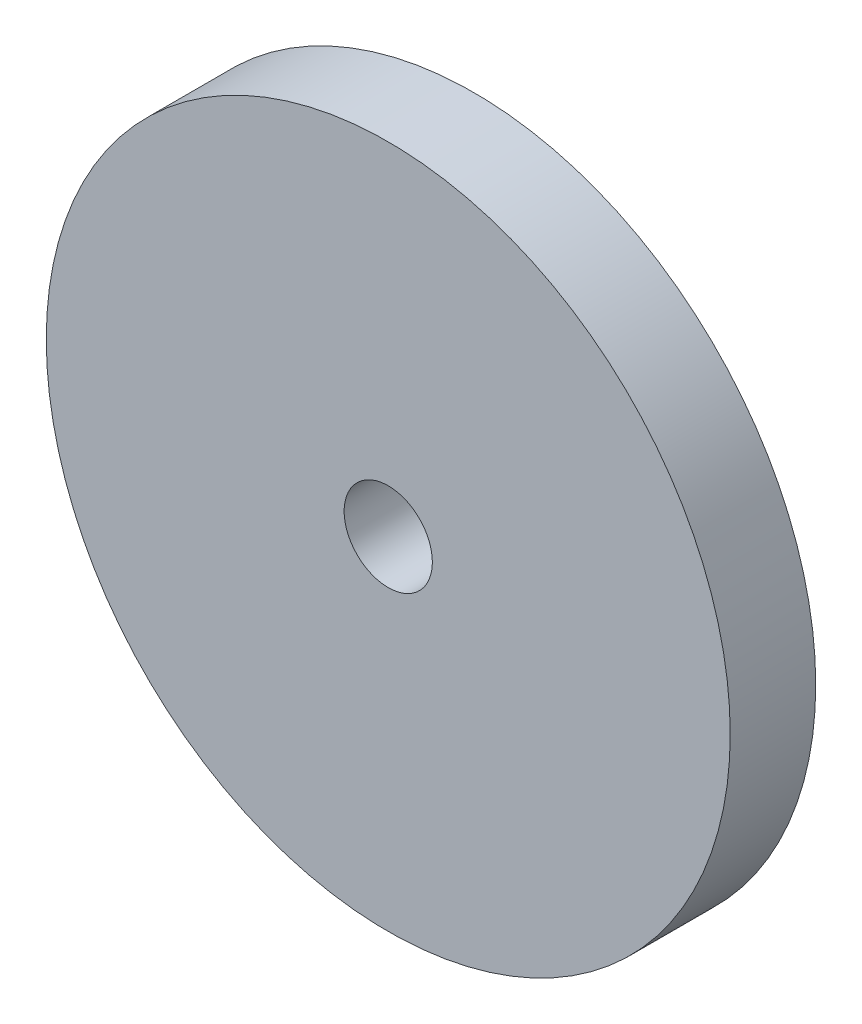
ISO-10303-21;
HEADER;
FILE_DESCRIPTION(('STEP AP214'),'2;1');
FILE_NAME('part.step','',(''),(''),'','','');
FILE_SCHEMA(('AUTOMOTIVE_DESIGN { 1 0 10303 214 1 1 1 1 }'));
ENDSEC;
DATA;
#1=APPLICATION_CONTEXT('core data for automotive mechanical design processes');
#2=APPLICATION_PROTOCOL_DEFINITION('international standard','automotive_design',2000,#1);
#3=PRODUCT_CONTEXT('',#1,'mechanical');
#4=PRODUCT('Part','Part','',(#3));
#5=PRODUCT_RELATED_PRODUCT_CATEGORY('part','',(#4));
#6=PRODUCT_DEFINITION_FORMATION('','',#4);
#7=PRODUCT_DEFINITION_CONTEXT('part definition',#1,'design');
#8=PRODUCT_DEFINITION('design','',#6,#7);
#9=PRODUCT_DEFINITION_SHAPE('','',#8);
#10=(LENGTH_UNIT() NAMED_UNIT(*) SI_UNIT(.MILLI.,.METRE.));
#11=(NAMED_UNIT(*) PLANE_ANGLE_UNIT() SI_UNIT($,.RADIAN.));
#12=(NAMED_UNIT(*) SI_UNIT($,.STERADIAN.) SOLID_ANGLE_UNIT());
#13=UNCERTAINTY_MEASURE_WITH_UNIT(LENGTH_MEASURE(1.E-05),#10,'distance_accuracy_value','');
#14=(GEOMETRIC_REPRESENTATION_CONTEXT(3) GLOBAL_UNCERTAINTY_ASSIGNED_CONTEXT((#13)) GLOBAL_UNIT_ASSIGNED_CONTEXT((#10,
#11,#12)) REPRESENTATION_CONTEXT('',''));
#15=CARTESIAN_POINT('',(0.,0.,0.));
#16=DIRECTION('',(0.,0.,1.));
#17=DIRECTION('',(1.,0.,0.));
#18=AXIS2_PLACEMENT_3D('',#15,#16,#17);
#19=CARTESIAN_POINT('',(0.,0.,6.35));
#20=DIRECTION('',(0.,0.,1.));
#21=DIRECTION('',(1.,0.,0.));
#22=AXIS2_PLACEMENT_3D('',#19,#20,#21);
#23=PLANE('',#22);
#24=CARTESIAN_POINT('',(0.,0.,6.35));
#25=DIRECTION('',(0.,0.,1.));
#26=DIRECTION('',(1.,0.,0.));
#27=AXIS2_PLACEMENT_3D('',#24,#25,#26);
#28=CIRCLE('',#27,25.4);
#29=CARTESIAN_POINT('',(25.4,0.,6.35));
#30=VERTEX_POINT('',#29);
#31=EDGE_CURVE('E10',#30,#30,#28,.T.);
#32=ORIENTED_EDGE('',*,*,#31,.T.);
#33=EDGE_LOOP('',(#32));
#34=FACE_BOUND('',#33,.T.);
#35=CARTESIAN_POINT('',(0.,0.,6.35));
#36=DIRECTION('',(0.,0.,1.));
#37=DIRECTION('',(1.,0.,0.));
#38=AXIS2_PLACEMENT_3D('',#35,#36,#37);
#39=CIRCLE('',#38,3.2766);
#40=CARTESIAN_POINT('',(3.2766,0.,6.35));
#41=VERTEX_POINT('',#40);
#42=EDGE_CURVE('E48',#41,#41,#39,.T.);
#43=ORIENTED_EDGE('',*,*,#42,.F.);
#44=EDGE_LOOP('',(#43));
#45=FACE_BOUND('',#44,.T.);
#46=ADVANCED_FACE('F37',(#34,#45),#23,.T.);
#47=CARTESIAN_POINT('',(0.,0.,0.));
#48=DIRECTION('',(0.,0.,1.));
#49=DIRECTION('',(1.,0.,0.));
#50=AXIS2_PLACEMENT_3D('',#47,#48,#49);
#51=PLANE('',#50);
#52=CARTESIAN_POINT('',(0.,0.,0.));
#53=DIRECTION('',(0.,0.,1.));
#54=DIRECTION('',(1.,0.,0.));
#55=AXIS2_PLACEMENT_3D('',#52,#53,#54);
#56=CIRCLE('',#55,25.4);
#57=CARTESIAN_POINT('',(25.4,0.,0.));
#58=VERTEX_POINT('',#57);
#59=EDGE_CURVE('E41',#58,#58,#56,.T.);
#60=ORIENTED_EDGE('',*,*,#59,.F.);
#61=EDGE_LOOP('',(#60));
#62=FACE_BOUND('',#61,.T.);
#63=CARTESIAN_POINT('',(0.,0.,0.));
#64=DIRECTION('',(0.,0.,1.));
#65=DIRECTION('',(1.,0.,0.));
#66=AXIS2_PLACEMENT_3D('',#63,#64,#65);
#67=CIRCLE('',#66,3.2766);
#68=CARTESIAN_POINT('',(3.2766,0.,0.));
#69=VERTEX_POINT('',#68);
#70=EDGE_CURVE('E50',#69,#69,#67,.T.);
#71=ORIENTED_EDGE('',*,*,#70,.T.);
#72=EDGE_LOOP('',(#71));
#73=FACE_BOUND('',#72,.T.);
#74=ADVANCED_FACE('F60',(#62,#73),#51,.F.);
#75=CARTESIAN_POINT('',(0.,0.,6.35));
#76=DIRECTION('',(0.,0.,-1.));
#77=DIRECTION('',(-1.,0.,0.));
#78=AXIS2_PLACEMENT_3D('',#75,#76,#77);
#79=CYLINDRICAL_SURFACE('',#78,25.4);
#80=ORIENTED_EDGE('',*,*,#31,.F.);
#81=EDGE_LOOP('',(#80));
#82=FACE_BOUND('',#81,.T.);
#83=ORIENTED_EDGE('',*,*,#59,.T.);
#84=EDGE_LOOP('',(#83));
#85=FACE_BOUND('',#84,.T.);
#86=ADVANCED_FACE('F39',(#82,#85),#79,.T.);
#87=CARTESIAN_POINT('',(0.,0.,6.35));
#88=DIRECTION('',(0.,0.,-1.));
#89=DIRECTION('',(-1.,0.,0.));
#90=AXIS2_PLACEMENT_3D('',#87,#88,#89);
#91=CYLINDRICAL_SURFACE('',#90,3.2766);
#92=ORIENTED_EDGE('',*,*,#42,.T.);
#93=EDGE_LOOP('',(#92));
#94=FACE_BOUND('',#93,.T.);
#95=ORIENTED_EDGE('',*,*,#70,.F.);
#96=EDGE_LOOP('',(#95));
#97=FACE_BOUND('',#96,.T.);
#98=ADVANCED_FACE('F56',(#94,#97),#91,.F.);
#99=CLOSED_SHELL('',(#46,#74,#86,#98));
#100=MANIFOLD_SOLID_BREP('B2',#99);
#101=ADVANCED_BREP_SHAPE_REPRESENTATION('',(#18,#100),#14);
#102=SHAPE_DEFINITION_REPRESENTATION(#9,#101);
ENDSEC;
END-ISO-10303-21;
